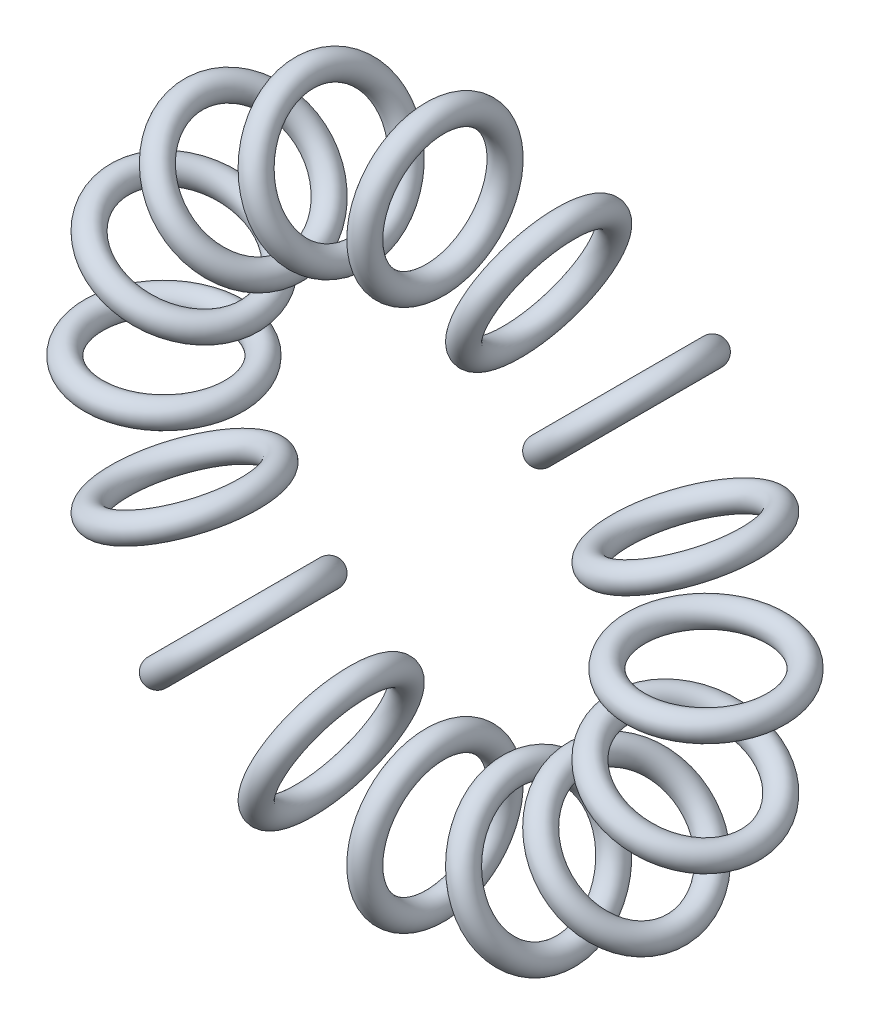
ISO-10303-21;
HEADER;
FILE_DESCRIPTION(('STEP AP214'),'2;1');
FILE_NAME('part.step','',(''),(''),'','','');
FILE_SCHEMA(('AUTOMOTIVE_DESIGN { 1 0 10303 214 1 1 1 1 }'));
ENDSEC;
DATA;
#1=APPLICATION_CONTEXT('core data for automotive mechanical design processes');
#2=APPLICATION_PROTOCOL_DEFINITION('international standard','automotive_design',2000,#1);
#3=PRODUCT_CONTEXT('',#1,'mechanical');
#4=PRODUCT('Part','Part','',(#3));
#5=PRODUCT_RELATED_PRODUCT_CATEGORY('part','',(#4));
#6=PRODUCT_DEFINITION_FORMATION('','',#4);
#7=PRODUCT_DEFINITION_CONTEXT('part definition',#1,'design');
#8=PRODUCT_DEFINITION('design','',#6,#7);
#9=PRODUCT_DEFINITION_SHAPE('','',#8);
#10=(LENGTH_UNIT() NAMED_UNIT(*) SI_UNIT(.MILLI.,.METRE.));
#11=(NAMED_UNIT(*) PLANE_ANGLE_UNIT() SI_UNIT($,.RADIAN.));
#12=(NAMED_UNIT(*) SI_UNIT($,.STERADIAN.) SOLID_ANGLE_UNIT());
#13=UNCERTAINTY_MEASURE_WITH_UNIT(LENGTH_MEASURE(1.E-05),#10,'distance_accuracy_value','');
#14=(GEOMETRIC_REPRESENTATION_CONTEXT(3) GLOBAL_UNCERTAINTY_ASSIGNED_CONTEXT((#13)) GLOBAL_UNIT_ASSIGNED_CONTEXT((#10,
#11,#12)) REPRESENTATION_CONTEXT('',''));
#15=CARTESIAN_POINT('',(0.,0.,0.));
#16=DIRECTION('',(0.,0.,1.));
#17=DIRECTION('',(1.,0.,0.));
#18=AXIS2_PLACEMENT_3D('',#15,#16,#17);
#19=CARTESIAN_POINT('',(8.13202293775789,19.632440065865,0.));
#20=DIRECTION('',(-0.923879532511292,0.382683432365077,0.));
#21=DIRECTION('',(0.,0.,1.));
#22=AXIS2_PLACEMENT_3D('',#19,#20,#21);
#23=TOROIDAL_SURFACE('',#22,5.5,1.);
#24=CARTESIAN_POINT('',(8.13202293775789,19.632440065865,6.5));
#25=VERTEX_POINT('',#24);
#26=VERTEX_LOOP('',#25);
#27=FACE_BOUND('',#26,.T.);
#28=ADVANCED_FACE('F37',(#27),#23,.T.);
#29=CLOSED_SHELL('',(#28));
#30=MANIFOLD_SOLID_BREP('B2',#29);
#31=CARTESIAN_POINT('',(15.026019100214,15.0260191002143,0.));
#32=DIRECTION('',(-0.707106781186556,0.707106781186539,0.));
#33=DIRECTION('',(0.,0.,1.));
#34=AXIS2_PLACEMENT_3D('',#31,#32,#33);
#35=TOROIDAL_SURFACE('',#34,5.5,1.);
#36=CARTESIAN_POINT('',(15.026019100214,15.0260191002143,6.5));
#37=VERTEX_POINT('',#36);
#38=VERTEX_LOOP('',#37);
#39=FACE_BOUND('',#38,.T.);
#40=ADVANCED_FACE('F57',(#39),#35,.T.);
#41=CLOSED_SHELL('',(#40));
#42=MANIFOLD_SOLID_BREP('B6',#41);
#43=CARTESIAN_POINT('',(19.6324400658648,8.13202293775837,0.));
#44=DIRECTION('',(-0.3826834323651,0.923879532511283,0.));
#45=DIRECTION('',(0.,0.,1.));
#46=AXIS2_PLACEMENT_3D('',#43,#44,#45);
#47=TOROIDAL_SURFACE('',#46,5.5,1.);
#48=CARTESIAN_POINT('',(19.6324400658648,8.13202293775837,6.5));
#49=VERTEX_POINT('',#48);
#50=VERTEX_LOOP('',#49);
#51=FACE_BOUND('',#50,.T.);
#52=ADVANCED_FACE('F77',(#51),#47,.T.);
#53=CLOSED_SHELL('',(#52));
#54=MANIFOLD_SOLID_BREP('B33',#53);
#55=CARTESIAN_POINT('',(21.25,2.22582064270723E-13,0.));
#56=DIRECTION('',(0.,1.,0.));
#57=DIRECTION('',(0.,0.,1.));
#58=AXIS2_PLACEMENT_3D('',#55,#56,#57);
#59=TOROIDAL_SURFACE('',#58,5.5,1.);
#60=CARTESIAN_POINT('',(21.25,2.22582064270723E-13,6.5));
#61=VERTEX_POINT('',#60);
#62=VERTEX_LOOP('',#61);
#63=FACE_BOUND('',#62,.T.);
#64=ADVANCED_FACE('F106',(#63),#59,.T.);
#65=CLOSED_SHELL('',(#64));
#66=MANIFOLD_SOLID_BREP('B53',#65);
#67=CARTESIAN_POINT('',(19.6324400658649,-8.13202293775796,0.));
#68=DIRECTION('',(0.382683432365081,0.923879532511291,0.));
#69=DIRECTION('',(0.,0.,1.));
#70=AXIS2_PLACEMENT_3D('',#67,#68,#69);
#71=TOROIDAL_SURFACE('',#70,5.5,1.);
#72=CARTESIAN_POINT('',(19.6324400658649,-8.13202293775796,6.5));
#73=VERTEX_POINT('',#72);
#74=VERTEX_LOOP('',#73);
#75=FACE_BOUND('',#74,.T.);
#76=ADVANCED_FACE('F126',(#75),#71,.T.);
#77=CLOSED_SHELL('',(#76));
#78=MANIFOLD_SOLID_BREP('B73',#77);
#79=CARTESIAN_POINT('',(15.0260191002143,-15.026019100214,0.));
#80=DIRECTION('',(0.707106781186541,0.707106781186554,0.));
#81=DIRECTION('',(0.,0.,1.));
#82=AXIS2_PLACEMENT_3D('',#79,#80,#81);
#83=TOROIDAL_SURFACE('',#82,5.5,1.);
#84=CARTESIAN_POINT('',(15.0260191002143,-15.026019100214,6.5));
#85=VERTEX_POINT('',#84);
#86=VERTEX_LOOP('',#85);
#87=FACE_BOUND('',#86,.T.);
#88=ADVANCED_FACE('F146',(#87),#83,.T.);
#89=CLOSED_SHELL('',(#88));
#90=MANIFOLD_SOLID_BREP('B102',#89);
#91=CARTESIAN_POINT('',(8.13202293775831,-19.6324400658648,0.));
#92=DIRECTION('',(0.923879532511284,0.382683432365097,0.));
#93=DIRECTION('',(0.,0.,1.));
#94=AXIS2_PLACEMENT_3D('',#91,#92,#93);
#95=TOROIDAL_SURFACE('',#94,5.5,1.);
#96=CARTESIAN_POINT('',(8.13202293775831,-19.6324400658648,6.5));
#97=VERTEX_POINT('',#96);
#98=VERTEX_LOOP('',#97);
#99=FACE_BOUND('',#98,.T.);
#100=ADVANCED_FACE('F166',(#99),#95,.T.);
#101=CLOSED_SHELL('',(#100));
#102=MANIFOLD_SOLID_BREP('B122',#101);
#103=CARTESIAN_POINT('',(1.48388042847149E-13,-21.25,0.));
#104=DIRECTION('',(1.,0.,0.));
#105=DIRECTION('',(0.,0.,1.));
#106=AXIS2_PLACEMENT_3D('',#103,#104,#105);
#107=TOROIDAL_SURFACE('',#106,5.5,1.);
#108=CARTESIAN_POINT('',(1.48388042847149E-13,-21.25,6.5));
#109=VERTEX_POINT('',#108);
#110=VERTEX_LOOP('',#109);
#111=FACE_BOUND('',#110,.T.);
#112=ADVANCED_FACE('F186',(#111),#107,.T.);
#113=CLOSED_SHELL('',(#112));
#114=MANIFOLD_SOLID_BREP('B142',#113);
#115=CARTESIAN_POINT('',(-8.13202293775804,-19.6324400658649,0.));
#116=DIRECTION('',(0.923879532511289,-0.382683432365084,0.));
#117=DIRECTION('',(0.,0.,1.));
#118=AXIS2_PLACEMENT_3D('',#115,#116,#117);
#119=TOROIDAL_SURFACE('',#118,5.5,1.);
#120=CARTESIAN_POINT('',(-8.13202293775804,-19.6324400658649,6.5));
#121=VERTEX_POINT('',#120);
#122=VERTEX_LOOP('',#121);
#123=FACE_BOUND('',#122,.T.);
#124=ADVANCED_FACE('F206',(#123),#119,.T.);
#125=CLOSED_SHELL('',(#124));
#126=MANIFOLD_SOLID_BREP('B162',#125);
#127=CARTESIAN_POINT('',(-15.0260191002141,-15.0260191002142,0.));
#128=DIRECTION('',(0.707106781186551,-0.707106781186544,0.));
#129=DIRECTION('',(0.,0.,1.));
#130=AXIS2_PLACEMENT_3D('',#127,#128,#129);
#131=TOROIDAL_SURFACE('',#130,5.5,1.);
#132=CARTESIAN_POINT('',(-15.0260191002141,-15.0260191002142,6.5));
#133=VERTEX_POINT('',#132);
#134=VERTEX_LOOP('',#133);
#135=FACE_BOUND('',#134,.T.);
#136=ADVANCED_FACE('F226',(#135),#131,.T.);
#137=CLOSED_SHELL('',(#136));
#138=MANIFOLD_SOLID_BREP('B182',#137);
#139=CARTESIAN_POINT('',(-19.6324400658648,-8.13202293775825,0.));
#140=DIRECTION('',(0.382683432365094,-0.923879532511285,0.));
#141=DIRECTION('',(0.,0.,1.));
#142=AXIS2_PLACEMENT_3D('',#139,#140,#141);
#143=TOROIDAL_SURFACE('',#142,5.5,1.);
#144=CARTESIAN_POINT('',(-19.6324400658648,-8.13202293775825,6.5));
#145=VERTEX_POINT('',#144);
#146=VERTEX_LOOP('',#145);
#147=FACE_BOUND('',#146,.T.);
#148=ADVANCED_FACE('F246',(#147),#143,.T.);
#149=CLOSED_SHELL('',(#148));
#150=MANIFOLD_SOLID_BREP('B202',#149);
#151=CARTESIAN_POINT('',(-21.25,0.,0.));
#152=DIRECTION('',(0.,-1.,0.));
#153=DIRECTION('',(0.,0.,1.));
#154=AXIS2_PLACEMENT_3D('',#151,#152,#153);
#155=TOROIDAL_SURFACE('',#154,5.5,1.);
#156=CARTESIAN_POINT('',(-21.25,0.,6.5));
#157=VERTEX_POINT('',#156);
#158=VERTEX_LOOP('',#157);
#159=FACE_BOUND('',#158,.T.);
#160=ADVANCED_FACE('F266',(#159),#155,.T.);
#161=CLOSED_SHELL('',(#160));
#162=MANIFOLD_SOLID_BREP('B222',#161);
#163=CARTESIAN_POINT('',(-19.6324400658649,8.13202293775811,0.));
#164=DIRECTION('',(-0.382683432365087,-0.923879532511288,0.));
#165=DIRECTION('',(0.,0.,1.));
#166=AXIS2_PLACEMENT_3D('',#163,#164,#165);
#167=TOROIDAL_SURFACE('',#166,5.5,1.);
#168=CARTESIAN_POINT('',(-19.6324400658649,8.13202293775811,6.5));
#169=VERTEX_POINT('',#168);
#170=VERTEX_LOOP('',#169);
#171=FACE_BOUND('',#170,.T.);
#172=ADVANCED_FACE('F286',(#171),#167,.T.);
#173=CLOSED_SHELL('',(#172));
#174=MANIFOLD_SOLID_BREP('B242',#173);
#175=CARTESIAN_POINT('',(-15.0260191002142,15.0260191002141,0.));
#176=DIRECTION('',(-0.707106781186546,-0.707106781186549,0.));
#177=DIRECTION('',(0.,0.,1.));
#178=AXIS2_PLACEMENT_3D('',#175,#176,#177);
#179=TOROIDAL_SURFACE('',#178,5.5,1.);
#180=CARTESIAN_POINT('',(-15.0260191002142,15.0260191002141,6.5));
#181=VERTEX_POINT('',#180);
#182=VERTEX_LOOP('',#181);
#183=FACE_BOUND('',#182,.T.);
#184=ADVANCED_FACE('F315',(#183),#179,.T.);
#185=CLOSED_SHELL('',(#184));
#186=MANIFOLD_SOLID_BREP('B262',#185);
#187=CARTESIAN_POINT('',(-8.13202293775818,19.6324400658648,0.));
#188=DIRECTION('',(-0.923879532511287,-0.382683432365091,0.));
#189=DIRECTION('',(0.,0.,1.));
#190=AXIS2_PLACEMENT_3D('',#187,#188,#189);
#191=TOROIDAL_SURFACE('',#190,5.5,1.);
#192=CARTESIAN_POINT('',(-8.13202293775818,19.6324400658648,6.5));
#193=VERTEX_POINT('',#192);
#194=VERTEX_LOOP('',#193);
#195=FACE_BOUND('',#194,.T.);
#196=ADVANCED_FACE('F334',(#195),#191,.T.);
#197=CLOSED_SHELL('',(#196));
#198=MANIFOLD_SOLID_BREP('B282',#197);
#199=CARTESIAN_POINT('',(0.,21.25,0.));
#200=DIRECTION('',(-1.,0.,0.));
#201=DIRECTION('',(0.,0.,1.));
#202=AXIS2_PLACEMENT_3D('',#199,#200,#201);
#203=TOROIDAL_SURFACE('',#202,5.5,1.);
#204=CARTESIAN_POINT('',(0.,21.25,6.5));
#205=VERTEX_POINT('',#204);
#206=VERTEX_LOOP('',#205);
#207=FACE_BOUND('',#206,.T.);
#208=ADVANCED_FACE('F348',(#207),#203,.T.);
#209=CLOSED_SHELL('',(#208));
#210=MANIFOLD_SOLID_BREP('B311',#209);
#211=ADVANCED_BREP_SHAPE_REPRESENTATION('',(#18,#30,#42,#54,#66,#78,#90,#102,#114,#126,#138,
#150,#162,#174,#186,#198,#210),#14);
#212=SHAPE_DEFINITION_REPRESENTATION(#9,#211);
ENDSEC;
END-ISO-10303-21;
